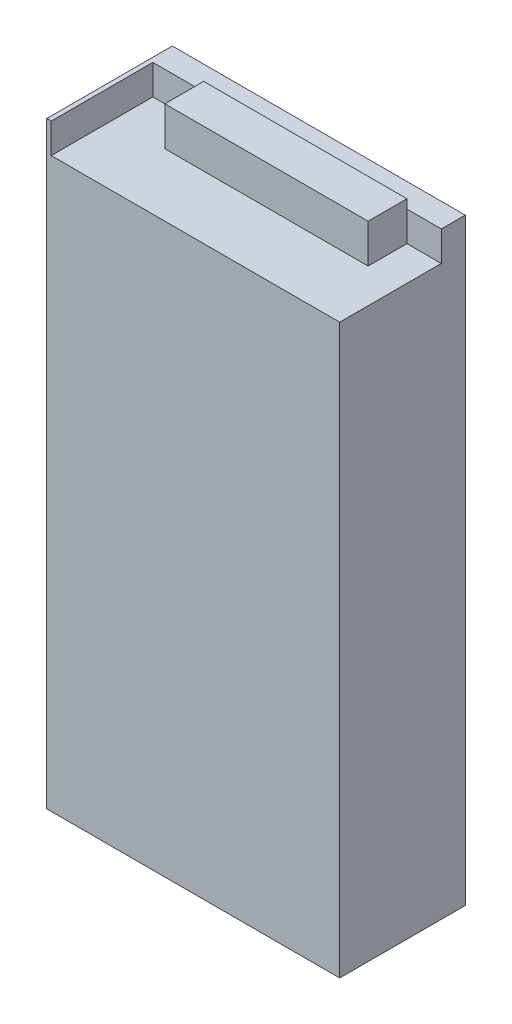
ISO-10303-21;
HEADER;
FILE_DESCRIPTION(('STEP AP214'),'2;1');
FILE_NAME('part.step','',(''),(''),'','','');
FILE_SCHEMA(('AUTOMOTIVE_DESIGN { 1 0 10303 214 1 1 1 1 }'));
ENDSEC;
DATA;
#1=APPLICATION_CONTEXT('core data for automotive mechanical design processes');
#2=APPLICATION_PROTOCOL_DEFINITION('international standard','automotive_design',2000,#1);
#3=PRODUCT_CONTEXT('',#1,'mechanical');
#4=PRODUCT('Part','Part','',(#3));
#5=PRODUCT_RELATED_PRODUCT_CATEGORY('part','',(#4));
#6=PRODUCT_DEFINITION_FORMATION('','',#4);
#7=PRODUCT_DEFINITION_CONTEXT('part definition',#1,'design');
#8=PRODUCT_DEFINITION('design','',#6,#7);
#9=PRODUCT_DEFINITION_SHAPE('','',#8);
#10=(LENGTH_UNIT() NAMED_UNIT(*) SI_UNIT(.MILLI.,.METRE.));
#11=(NAMED_UNIT(*) PLANE_ANGLE_UNIT() SI_UNIT($,.RADIAN.));
#12=(NAMED_UNIT(*) SI_UNIT($,.STERADIAN.) SOLID_ANGLE_UNIT());
#13=UNCERTAINTY_MEASURE_WITH_UNIT(LENGTH_MEASURE(1.E-05),#10,'distance_accuracy_value','');
#14=(GEOMETRIC_REPRESENTATION_CONTEXT(3) GLOBAL_UNCERTAINTY_ASSIGNED_CONTEXT((#13)) GLOBAL_UNIT_ASSIGNED_CONTEXT((#10,
#11,#12)) REPRESENTATION_CONTEXT('',''));
#15=CARTESIAN_POINT('',(0.,0.,0.));
#16=DIRECTION('',(0.,0.,1.));
#17=DIRECTION('',(1.,0.,0.));
#18=AXIS2_PLACEMENT_3D('',#15,#16,#17);
#19=CARTESIAN_POINT('',(-16.690647767675,22.3969545957918,8.));
#20=DIRECTION('',(0.,-1.,0.));
#21=DIRECTION('',(1.,0.,0.));
#22=AXIS2_PLACEMENT_3D('',#19,#20,#21);
#23=PLANE('',#22);
#24=DIRECTION('',(0.,0.,1.));
#25=VECTOR('',#24,1.);
#26=CARTESIAN_POINT('',(0.309352232325018,22.3969545957918,8.));
#27=LINE('',#26,#25);
#28=CARTESIAN_POINT('',(0.309352232325018,22.3969545957918,8.));
#29=VERTEX_POINT('',#28);
#30=CARTESIAN_POINT('',(0.309352232325019,22.3969545957918,21.));
#31=VERTEX_POINT('',#30);
#32=EDGE_CURVE('E144',#29,#31,#27,.T.);
#33=ORIENTED_EDGE('',*,*,#32,.F.);
#34=DIRECTION('',(1.,0.,0.));
#35=VECTOR('',#34,1.);
#36=CARTESIAN_POINT('',(-16.690647767675,22.3969545957918,8.));
#37=LINE('',#36,#35);
#38=CARTESIAN_POINT('',(-16.690647767675,22.3969545957918,8.));
#39=VERTEX_POINT('',#38);
#40=EDGE_CURVE('E157',#39,#29,#37,.T.);
#41=ORIENTED_EDGE('',*,*,#40,.F.);
#42=DIRECTION('',(0.,0.,1.));
#43=VECTOR('',#42,1.);
#44=CARTESIAN_POINT('',(-16.690647767675,22.3969545957918,8.));
#45=LINE('',#44,#43);
#46=CARTESIAN_POINT('',(-16.690647767675,22.3969545957918,42.));
#47=VERTEX_POINT('',#46);
#48=EDGE_CURVE('E165',#39,#47,#45,.T.);
#49=ORIENTED_EDGE('',*,*,#48,.T.);
#50=DIRECTION('',(1.,0.,0.));
#51=VECTOR('',#50,1.);
#52=CARTESIAN_POINT('',(-16.690647767675,22.3969545957918,42.));
#53=LINE('',#52,#51);
#54=CARTESIAN_POINT('',(79.8093522323251,22.3969545957918,42.));
#55=VERTEX_POINT('',#54);
#56=EDGE_CURVE('E147',#47,#55,#53,.T.);
#57=ORIENTED_EDGE('',*,*,#56,.T.);
#58=DIRECTION('',(0.,0.,1.));
#59=VECTOR('',#58,1.);
#60=CARTESIAN_POINT('',(79.8093522323251,22.3969545957918,8.));
#61=LINE('',#60,#59);
#62=CARTESIAN_POINT('',(79.8093522323251,22.3969545957918,8.));
#63=VERTEX_POINT('',#62);
#64=EDGE_CURVE('E172',#63,#55,#61,.T.);
#65=ORIENTED_EDGE('',*,*,#64,.F.);
#66=CARTESIAN_POINT('',(68.309352232325,22.3969545957918,8.));
#67=VERTEX_POINT('',#66);
#68=EDGE_CURVE('E156',#67,#63,#37,.T.);
#69=ORIENTED_EDGE('',*,*,#68,.F.);
#70=DIRECTION('',(0.,0.,-1.));
#71=VECTOR('',#70,1.);
#72=CARTESIAN_POINT('',(68.309352232325,22.3969545957918,8.));
#73=LINE('',#72,#71);
#74=CARTESIAN_POINT('',(68.309352232325,22.3969545957918,21.));
#75=VERTEX_POINT('',#74);
#76=EDGE_CURVE('E48',#75,#67,#73,.T.);
#77=ORIENTED_EDGE('',*,*,#76,.F.);
#78=DIRECTION('',(1.,0.,0.));
#79=VECTOR('',#78,1.);
#80=CARTESIAN_POINT('',(0.309352232325019,22.3969545957918,21.));
#81=LINE('',#80,#79);
#82=EDGE_CURVE('E426',#31,#75,#81,.T.);
#83=ORIENTED_EDGE('',*,*,#82,.F.);
#84=EDGE_LOOP('',(#33,#41,#49,#57,#65,#69,#77,#83));
#85=FACE_BOUND('',#84,.T.);
#86=ADVANCED_FACE('F33',(#85),#23,.F.);
#87=CARTESIAN_POINT('',(-16.690647767675,22.3969545957918,8.));
#88=DIRECTION('',(0.,0.,1.));
#89=DIRECTION('',(1.,0.,0.));
#90=AXIS2_PLACEMENT_3D('',#87,#88,#89);
#91=PLANE('',#90);
#92=ORIENTED_EDGE('',*,*,#40,.T.);
#93=DIRECTION('',(0.,1.,0.));
#94=VECTOR('',#93,1.);
#95=CARTESIAN_POINT('',(0.309352232325016,22.3969545957918,8.));
#96=LINE('',#95,#94);
#97=CARTESIAN_POINT('',(0.309352232325017,32.3969545957918,8.));
#98=VERTEX_POINT('',#97);
#99=EDGE_CURVE('E11',#29,#98,#96,.T.);
#100=ORIENTED_EDGE('',*,*,#99,.T.);
#101=DIRECTION('',(-1.,0.,0.));
#102=VECTOR('',#101,1.);
#103=CARTESIAN_POINT('',(-16.690647767675,32.3969545957918,8.));
#104=LINE('',#103,#102);
#105=CARTESIAN_POINT('',(-16.690647767675,32.3969545957918,8.));
#106=VERTEX_POINT('',#105);
#107=EDGE_CURVE('E162',#98,#106,#104,.T.);
#108=ORIENTED_EDGE('',*,*,#107,.T.);
#109=DIRECTION('',(0.,-1.,0.));
#110=VECTOR('',#109,1.);
#111=CARTESIAN_POINT('',(-16.690647767675,32.3969545957918,8.));
#112=LINE('',#111,#110);
#113=EDGE_CURVE('E153',#106,#39,#112,.T.);
#114=ORIENTED_EDGE('',*,*,#113,.T.);
#115=EDGE_LOOP('',(#92,#100,#108,#114));
#116=FACE_BOUND('',#115,.T.);
#117=ADVANCED_FACE('F252',(#116),#91,.T.);
#118=CARTESIAN_POINT('',(79.809352232325,32.3969545957918,8.));
#119=VERTEX_POINT('',#118);
#120=CARTESIAN_POINT('',(68.309352232325,32.3969545957918,8.));
#121=VERTEX_POINT('',#120);
#122=EDGE_CURVE('E163',#119,#121,#104,.T.);
#123=ORIENTED_EDGE('',*,*,#122,.T.);
#124=DIRECTION('',(0.,-1.,0.));
#125=VECTOR('',#124,1.);
#126=CARTESIAN_POINT('',(68.309352232325,22.3969545957918,8.));
#127=LINE('',#126,#125);
#128=EDGE_CURVE('E41',#121,#67,#127,.T.);
#129=ORIENTED_EDGE('',*,*,#128,.T.);
#130=ORIENTED_EDGE('',*,*,#68,.T.);
#131=DIRECTION('',(0.,1.,0.));
#132=VECTOR('',#131,1.);
#133=CARTESIAN_POINT('',(79.809352232325,32.3969545957918,8.));
#134=LINE('',#133,#132);
#135=EDGE_CURVE('E160',#63,#119,#134,.T.);
#136=ORIENTED_EDGE('',*,*,#135,.T.);
#137=EDGE_LOOP('',(#123,#129,#130,#136));
#138=FACE_BOUND('',#137,.T.);
#139=ADVANCED_FACE('F231',(#138),#91,.T.);
#140=CARTESIAN_POINT('',(-18.190647767675,-167.603045404208,0.));
#141=DIRECTION('',(0.,0.,1.));
#142=DIRECTION('',(1.,0.,0.));
#143=AXIS2_PLACEMENT_3D('',#140,#141,#142);
#144=PLANE('',#143);
#145=CARTESIAN_POINT('',(-9.19064776767497,-150.103045404208,0.));
#146=DIRECTION('',(0.,0.,1.));
#147=DIRECTION('',(1.,0.,0.));
#148=AXIS2_PLACEMENT_3D('',#145,#146,#147);
#149=CIRCLE('',#148,1.5);
#150=CARTESIAN_POINT('',(-7.69064776767497,-150.103045404208,0.));
#151=VERTEX_POINT('',#150);
#152=EDGE_CURVE('E179',#151,#151,#149,.T.);
#153=ORIENTED_EDGE('',*,*,#152,.T.);
#154=EDGE_LOOP('',(#153));
#155=FACE_BOUND('',#154,.T.);
#156=CARTESIAN_POINT('',(-9.19064776767499,-30.1030454042082,0.));
#157=DIRECTION('',(0.,0.,1.));
#158=DIRECTION('',(1.,0.,0.));
#159=AXIS2_PLACEMENT_3D('',#156,#157,#158);
#160=CIRCLE('',#159,1.5);
#161=CARTESIAN_POINT('',(-7.69064776767499,-30.1030454042082,0.));
#162=VERTEX_POINT('',#161);
#163=EDGE_CURVE('E191',#162,#162,#160,.T.);
#164=ORIENTED_EDGE('',*,*,#163,.T.);
#165=EDGE_LOOP('',(#164));
#166=FACE_BOUND('',#165,.T.);
#167=DIRECTION('',(0.,-1.,0.));
#168=VECTOR('',#167,1.);
#169=CARTESIAN_POINT('',(-18.190647767675,32.3969545957918,0.));
#170=LINE('',#169,#168);
#171=CARTESIAN_POINT('',(-18.190647767675,32.3969545957918,0.));
#172=VERTEX_POINT('',#171);
#173=CARTESIAN_POINT('',(-18.190647767675,-167.603045404208,0.));
#174=VERTEX_POINT('',#173);
#175=EDGE_CURVE('E197',#172,#174,#170,.T.);
#176=ORIENTED_EDGE('',*,*,#175,.F.);
#177=DIRECTION('',(-1.,0.,0.));
#178=VECTOR('',#177,1.);
#179=CARTESIAN_POINT('',(-18.190647767675,32.3969545957918,0.));
#180=LINE('',#179,#178);
#181=CARTESIAN_POINT('',(79.809352232325,32.3969545957918,0.));
#182=VERTEX_POINT('',#181);
#183=EDGE_CURVE('E204',#182,#172,#180,.T.);
#184=ORIENTED_EDGE('',*,*,#183,.F.);
#185=DIRECTION('',(0.,1.,0.));
#186=VECTOR('',#185,1.);
#187=CARTESIAN_POINT('',(79.809352232325,32.3969545957918,0.));
#188=LINE('',#187,#186);
#189=CARTESIAN_POINT('',(79.8093522323251,-167.603045404208,0.));
#190=VERTEX_POINT('',#189);
#191=EDGE_CURVE('E216',#190,#182,#188,.T.);
#192=ORIENTED_EDGE('',*,*,#191,.F.);
#193=DIRECTION('',(1.,0.,0.));
#194=VECTOR('',#193,1.);
#195=CARTESIAN_POINT('',(-18.190647767675,-167.603045404208,0.));
#196=LINE('',#195,#194);
#197=EDGE_CURVE('E214',#174,#190,#196,.T.);
#198=ORIENTED_EDGE('',*,*,#197,.F.);
#199=EDGE_LOOP('',(#176,#184,#192,#198));
#200=FACE_BOUND('',#199,.T.);
#201=CARTESIAN_POINT('',(70.809352232325,-30.1030454042082,0.));
#202=DIRECTION('',(0.,0.,1.));
#203=DIRECTION('',(1.,0.,0.));
#204=AXIS2_PLACEMENT_3D('',#201,#202,#203);
#205=CIRCLE('',#204,1.5);
#206=CARTESIAN_POINT('',(72.309352232325,-30.1030454042082,0.));
#207=VERTEX_POINT('',#206);
#208=EDGE_CURVE('E185',#207,#207,#205,.T.);
#209=ORIENTED_EDGE('',*,*,#208,.T.);
#210=EDGE_LOOP('',(#209));
#211=FACE_BOUND('',#210,.T.);
#212=CARTESIAN_POINT('',(70.809352232325,-150.103045404208,0.));
#213=DIRECTION('',(0.,0.,1.));
#214=DIRECTION('',(1.,0.,0.));
#215=AXIS2_PLACEMENT_3D('',#212,#213,#214);
#216=CIRCLE('',#215,1.5);
#217=CARTESIAN_POINT('',(72.309352232325,-150.103045404208,0.));
#218=VERTEX_POINT('',#217);
#219=EDGE_CURVE('E171',#218,#218,#216,.T.);
#220=ORIENTED_EDGE('',*,*,#219,.T.);
#221=EDGE_LOOP('',(#220));
#222=FACE_BOUND('',#221,.T.);
#223=ADVANCED_FACE('F266',(#155,#166,#200,#211,#222),#144,.F.);
#224=CARTESIAN_POINT('',(-18.190647767675,32.3969545957918,42.));
#225=DIRECTION('',(1.,0.,0.));
#226=DIRECTION('',(0.,1.,0.));
#227=AXIS2_PLACEMENT_3D('',#224,#225,#226);
#228=PLANE('',#227);
#229=ORIENTED_EDGE('',*,*,#175,.T.);
#230=DIRECTION('',(0.,0.,-1.));
#231=VECTOR('',#230,1.);
#232=CARTESIAN_POINT('',(-18.190647767675,-167.603045404208,42.));
#233=LINE('',#232,#231);
#234=CARTESIAN_POINT('',(-18.190647767675,-167.603045404208,42.));
#235=VERTEX_POINT('',#234);
#236=EDGE_CURVE('E227',#235,#174,#233,.T.);
#237=ORIENTED_EDGE('',*,*,#236,.F.);
#238=DIRECTION('',(0.,-1.,0.));
#239=VECTOR('',#238,1.);
#240=CARTESIAN_POINT('',(-18.190647767675,32.3969545957918,42.));
#241=LINE('',#240,#239);
#242=CARTESIAN_POINT('',(-18.190647767675,32.3969545957918,42.));
#243=VERTEX_POINT('',#242);
#244=EDGE_CURVE('E200',#243,#235,#241,.T.);
#245=ORIENTED_EDGE('',*,*,#244,.F.);
#246=DIRECTION('',(0.,0.,-1.));
#247=VECTOR('',#246,1.);
#248=CARTESIAN_POINT('',(-18.190647767675,32.3969545957918,42.));
#249=LINE('',#248,#247);
#250=EDGE_CURVE('E211',#243,#172,#249,.T.);
#251=ORIENTED_EDGE('',*,*,#250,.T.);
#252=EDGE_LOOP('',(#229,#237,#245,#251));
#253=FACE_BOUND('',#252,.T.);
#254=ADVANCED_FACE('F35',(#253),#228,.F.);
#255=CARTESIAN_POINT('',(-18.190647767675,-167.603045404208,42.));
#256=DIRECTION('',(0.,1.,0.));
#257=DIRECTION('',(0.,0.,1.));
#258=AXIS2_PLACEMENT_3D('',#255,#256,#257);
#259=PLANE('',#258);
#260=ORIENTED_EDGE('',*,*,#197,.T.);
#261=DIRECTION('',(0.,0.,-1.));
#262=VECTOR('',#261,1.);
#263=CARTESIAN_POINT('',(79.8093522323251,-167.603045404208,42.));
#264=LINE('',#263,#262);
#265=CARTESIAN_POINT('',(79.8093522323251,-167.603045404208,42.));
#266=VERTEX_POINT('',#265);
#267=EDGE_CURVE('E224',#266,#190,#264,.T.);
#268=ORIENTED_EDGE('',*,*,#267,.F.);
#269=DIRECTION('',(1.,0.,0.));
#270=VECTOR('',#269,1.);
#271=CARTESIAN_POINT('',(-18.190647767675,-167.603045404208,42.));
#272=LINE('',#271,#270);
#273=EDGE_CURVE('E203',#235,#266,#272,.T.);
#274=ORIENTED_EDGE('',*,*,#273,.F.);
#275=ORIENTED_EDGE('',*,*,#236,.T.);
#276=EDGE_LOOP('',(#260,#268,#274,#275));
#277=FACE_BOUND('',#276,.T.);
#278=ADVANCED_FACE('F269',(#277),#259,.F.);
#279=CARTESIAN_POINT('',(79.809352232325,32.3969545957918,42.));
#280=DIRECTION('',(-1.,0.,0.));
#281=DIRECTION('',(0.,-1.,0.));
#282=AXIS2_PLACEMENT_3D('',#279,#280,#281);
#283=PLANE('',#282);
#284=ORIENTED_EDGE('',*,*,#135,.F.);
#285=ORIENTED_EDGE('',*,*,#64,.T.);
#286=DIRECTION('',(0.,1.,0.));
#287=VECTOR('',#286,1.);
#288=CARTESIAN_POINT('',(79.809352232325,32.3969545957918,42.));
#289=LINE('',#288,#287);
#290=EDGE_CURVE('E206',#266,#55,#289,.T.);
#291=ORIENTED_EDGE('',*,*,#290,.F.);
#292=ORIENTED_EDGE('',*,*,#267,.T.);
#293=ORIENTED_EDGE('',*,*,#191,.T.);
#294=DIRECTION('',(0.,0.,-1.));
#295=VECTOR('',#294,1.);
#296=CARTESIAN_POINT('',(79.809352232325,32.3969545957918,42.));
#297=LINE('',#296,#295);
#298=EDGE_CURVE('E222',#119,#182,#297,.T.);
#299=ORIENTED_EDGE('',*,*,#298,.F.);
#300=EDGE_LOOP('',(#284,#285,#291,#292,#293,#299));
#301=FACE_BOUND('',#300,.T.);
#302=ADVANCED_FACE('F242',(#301),#283,.F.);
#303=CARTESIAN_POINT('',(-18.190647767675,32.3969545957918,42.));
#304=DIRECTION('',(0.,-1.,0.));
#305=DIRECTION('',(0.,0.,-1.));
#306=AXIS2_PLACEMENT_3D('',#303,#304,#305);
#307=PLANE('',#306);
#308=DIRECTION('',(-1.,0.,0.));
#309=VECTOR('',#308,1.);
#310=CARTESIAN_POINT('',(-18.190647767675,32.3969545957918,42.));
#311=LINE('',#310,#309);
#312=CARTESIAN_POINT('',(-16.690647767675,32.3969545957918,42.));
#313=VERTEX_POINT('',#312);
#314=EDGE_CURVE('E209',#313,#243,#311,.T.);
#315=ORIENTED_EDGE('',*,*,#314,.F.);
#316=DIRECTION('',(0.,0.,1.));
#317=VECTOR('',#316,1.);
#318=CARTESIAN_POINT('',(-16.690647767675,32.3969545957918,8.));
#319=LINE('',#318,#317);
#320=EDGE_CURVE('E169',#106,#313,#319,.T.);
#321=ORIENTED_EDGE('',*,*,#320,.F.);
#322=ORIENTED_EDGE('',*,*,#107,.F.);
#323=EDGE_CURVE('E166',#121,#98,#104,.T.);
#324=ORIENTED_EDGE('',*,*,#323,.F.);
#325=ORIENTED_EDGE('',*,*,#122,.F.);
#326=ORIENTED_EDGE('',*,*,#298,.T.);
#327=ORIENTED_EDGE('',*,*,#183,.T.);
#328=ORIENTED_EDGE('',*,*,#250,.F.);
#329=EDGE_LOOP('',(#315,#321,#322,#324,#325,#326,#327,#328));
#330=FACE_BOUND('',#329,.T.);
#331=ADVANCED_FACE('F246',(#330),#307,.F.);
#332=CARTESIAN_POINT('',(-18.190647767675,-167.603045404208,42.));
#333=DIRECTION('',(0.,0.,1.));
#334=DIRECTION('',(1.,0.,0.));
#335=AXIS2_PLACEMENT_3D('',#332,#333,#334);
#336=PLANE('',#335);
#337=DIRECTION('',(0.,-1.,0.));
#338=VECTOR('',#337,1.);
#339=CARTESIAN_POINT('',(-16.690647767675,32.3969545957918,42.));
#340=LINE('',#339,#338);
#341=EDGE_CURVE('E56',#313,#47,#340,.T.);
#342=ORIENTED_EDGE('',*,*,#341,.F.);
#343=ORIENTED_EDGE('',*,*,#314,.T.);
#344=ORIENTED_EDGE('',*,*,#244,.T.);
#345=ORIENTED_EDGE('',*,*,#273,.T.);
#346=ORIENTED_EDGE('',*,*,#290,.T.);
#347=ORIENTED_EDGE('',*,*,#56,.F.);
#348=EDGE_LOOP('',(#342,#343,#344,#345,#346,#347));
#349=FACE_BOUND('',#348,.T.);
#350=ADVANCED_FACE('F258',(#349),#336,.T.);
#351=CARTESIAN_POINT('',(-9.19064776767499,-30.1030454042082,5.));
#352=DIRECTION('',(0.,0.,-1.));
#353=DIRECTION('',(-1.,0.,0.));
#354=AXIS2_PLACEMENT_3D('',#351,#352,#353);
#355=CYLINDRICAL_SURFACE('',#354,1.5);
#356=CARTESIAN_POINT('',(-9.19064776767499,-30.1030454042082,5.));
#357=DIRECTION('',(0.,0.,1.));
#358=DIRECTION('',(1.,0.,0.));
#359=AXIS2_PLACEMENT_3D('',#356,#357,#358);
#360=CIRCLE('',#359,1.5);
#361=CARTESIAN_POINT('',(-7.69064776767499,-30.1030454042082,5.));
#362=VERTEX_POINT('',#361);
#363=EDGE_CURVE('E194',#362,#362,#360,.T.);
#364=ORIENTED_EDGE('',*,*,#363,.T.);
#365=EDGE_LOOP('',(#364));
#366=FACE_BOUND('',#365,.T.);
#367=ORIENTED_EDGE('',*,*,#163,.F.);
#368=EDGE_LOOP('',(#367));
#369=FACE_BOUND('',#368,.T.);
#370=ADVANCED_FACE('F316',(#366,#369),#355,.F.);
#371=CARTESIAN_POINT('',(-9.19064776767499,-30.1030454042082,5.));
#372=DIRECTION('',(0.,0.,1.));
#373=DIRECTION('',(1.,0.,0.));
#374=AXIS2_PLACEMENT_3D('',#371,#372,#373);
#375=PLANE('',#374);
#376=ORIENTED_EDGE('',*,*,#363,.F.);
#377=EDGE_LOOP('',(#376));
#378=FACE_BOUND('',#377,.T.);
#379=ADVANCED_FACE('F312',(#378),#375,.F.);
#380=CARTESIAN_POINT('',(70.809352232325,-30.1030454042082,5.));
#381=DIRECTION('',(0.,0.,-1.));
#382=DIRECTION('',(-1.,0.,0.));
#383=AXIS2_PLACEMENT_3D('',#380,#381,#382);
#384=CYLINDRICAL_SURFACE('',#383,1.5);
#385=CARTESIAN_POINT('',(70.809352232325,-30.1030454042082,5.));
#386=DIRECTION('',(0.,0.,1.));
#387=DIRECTION('',(1.,0.,0.));
#388=AXIS2_PLACEMENT_3D('',#385,#386,#387);
#389=CIRCLE('',#388,1.5);
#390=CARTESIAN_POINT('',(72.309352232325,-30.1030454042082,5.));
#391=VERTEX_POINT('',#390);
#392=EDGE_CURVE('E188',#391,#391,#389,.T.);
#393=ORIENTED_EDGE('',*,*,#392,.T.);
#394=EDGE_LOOP('',(#393));
#395=FACE_BOUND('',#394,.T.);
#396=ORIENTED_EDGE('',*,*,#208,.F.);
#397=EDGE_LOOP('',(#396));
#398=FACE_BOUND('',#397,.T.);
#399=ADVANCED_FACE('F308',(#395,#398),#384,.F.);
#400=CARTESIAN_POINT('',(70.809352232325,-30.1030454042082,5.));
#401=DIRECTION('',(0.,0.,1.));
#402=DIRECTION('',(1.,0.,0.));
#403=AXIS2_PLACEMENT_3D('',#400,#401,#402);
#404=PLANE('',#403);
#405=ORIENTED_EDGE('',*,*,#392,.F.);
#406=EDGE_LOOP('',(#405));
#407=FACE_BOUND('',#406,.T.);
#408=ADVANCED_FACE('F304',(#407),#404,.F.);
#409=CARTESIAN_POINT('',(-9.19064776767497,-150.103045404208,5.));
#410=DIRECTION('',(0.,0.,-1.));
#411=DIRECTION('',(-1.,0.,0.));
#412=AXIS2_PLACEMENT_3D('',#409,#410,#411);
#413=CYLINDRICAL_SURFACE('',#412,1.5);
#414=CARTESIAN_POINT('',(-9.19064776767497,-150.103045404208,5.));
#415=DIRECTION('',(0.,0.,1.));
#416=DIRECTION('',(1.,0.,0.));
#417=AXIS2_PLACEMENT_3D('',#414,#415,#416);
#418=CIRCLE('',#417,1.5);
#419=CARTESIAN_POINT('',(-7.69064776767497,-150.103045404208,5.));
#420=VERTEX_POINT('',#419);
#421=EDGE_CURVE('E182',#420,#420,#418,.T.);
#422=ORIENTED_EDGE('',*,*,#421,.T.);
#423=EDGE_LOOP('',(#422));
#424=FACE_BOUND('',#423,.T.);
#425=ORIENTED_EDGE('',*,*,#152,.F.);
#426=EDGE_LOOP('',(#425));
#427=FACE_BOUND('',#426,.T.);
#428=ADVANCED_FACE('F300',(#424,#427),#413,.F.);
#429=CARTESIAN_POINT('',(-9.19064776767497,-150.103045404208,5.));
#430=DIRECTION('',(0.,0.,1.));
#431=DIRECTION('',(1.,0.,0.));
#432=AXIS2_PLACEMENT_3D('',#429,#430,#431);
#433=PLANE('',#432);
#434=ORIENTED_EDGE('',*,*,#421,.F.);
#435=EDGE_LOOP('',(#434));
#436=FACE_BOUND('',#435,.T.);
#437=ADVANCED_FACE('F296',(#436),#433,.F.);
#438=CARTESIAN_POINT('',(70.809352232325,-150.103045404208,5.));
#439=DIRECTION('',(0.,0.,-1.));
#440=DIRECTION('',(-1.,0.,0.));
#441=AXIS2_PLACEMENT_3D('',#438,#439,#440);
#442=CYLINDRICAL_SURFACE('',#441,1.5);
#443=CARTESIAN_POINT('',(70.809352232325,-150.103045404208,5.));
#444=DIRECTION('',(0.,0.,1.));
#445=DIRECTION('',(1.,0.,0.));
#446=AXIS2_PLACEMENT_3D('',#443,#444,#445);
#447=CIRCLE('',#446,1.5);
#448=CARTESIAN_POINT('',(72.309352232325,-150.103045404208,5.));
#449=VERTEX_POINT('',#448);
#450=EDGE_CURVE('E176',#449,#449,#447,.T.);
#451=ORIENTED_EDGE('',*,*,#450,.T.);
#452=EDGE_LOOP('',(#451));
#453=FACE_BOUND('',#452,.T.);
#454=ORIENTED_EDGE('',*,*,#219,.F.);
#455=EDGE_LOOP('',(#454));
#456=FACE_BOUND('',#455,.T.);
#457=ADVANCED_FACE('F292',(#453,#456),#442,.F.);
#458=CARTESIAN_POINT('',(70.809352232325,-150.103045404208,5.));
#459=DIRECTION('',(0.,0.,1.));
#460=DIRECTION('',(1.,0.,0.));
#461=AXIS2_PLACEMENT_3D('',#458,#459,#460);
#462=PLANE('',#461);
#463=ORIENTED_EDGE('',*,*,#450,.F.);
#464=EDGE_LOOP('',(#463));
#465=FACE_BOUND('',#464,.T.);
#466=ADVANCED_FACE('F290',(#465),#462,.F.);
#467=CARTESIAN_POINT('',(-16.690647767675,32.3969545957918,8.));
#468=DIRECTION('',(-1.,0.,0.));
#469=DIRECTION('',(0.,0.,1.));
#470=AXIS2_PLACEMENT_3D('',#467,#468,#469);
#471=PLANE('',#470);
#472=ORIENTED_EDGE('',*,*,#341,.T.);
#473=ORIENTED_EDGE('',*,*,#48,.F.);
#474=ORIENTED_EDGE('',*,*,#113,.F.);
#475=ORIENTED_EDGE('',*,*,#320,.T.);
#476=EDGE_LOOP('',(#472,#473,#474,#475));
#477=FACE_BOUND('',#476,.T.);
#478=ADVANCED_FACE('F253',(#477),#471,.F.);
#479=CARTESIAN_POINT('',(0.309352232325017,35.3969545957918,8.));
#480=DIRECTION('',(0.,0.,1.));
#481=DIRECTION('',(1.,0.,0.));
#482=AXIS2_PLACEMENT_3D('',#479,#480,#481);
#483=PLANE('',#482);
#484=DIRECTION('',(0.,-1.,0.));
#485=VECTOR('',#484,1.);
#486=CARTESIAN_POINT('',(68.309352232325,35.3969545957918,8.));
#487=LINE('',#486,#485);
#488=CARTESIAN_POINT('',(68.309352232325,35.3969545957918,8.));
#489=VERTEX_POINT('',#488);
#490=EDGE_CURVE('E149',#489,#121,#487,.T.);
#491=ORIENTED_EDGE('',*,*,#490,.T.);
#492=ORIENTED_EDGE('',*,*,#323,.T.);
#493=DIRECTION('',(0.,-1.,0.));
#494=VECTOR('',#493,1.);
#495=CARTESIAN_POINT('',(0.309352232325017,35.3969545957918,8.));
#496=LINE('',#495,#494);
#497=CARTESIAN_POINT('',(0.309352232325017,35.3969545957918,8.));
#498=VERTEX_POINT('',#497);
#499=EDGE_CURVE('E422',#498,#98,#496,.T.);
#500=ORIENTED_EDGE('',*,*,#499,.F.);
#501=DIRECTION('',(-1.,0.,0.));
#502=VECTOR('',#501,1.);
#503=CARTESIAN_POINT('',(0.309352232325017,35.3969545957918,8.));
#504=LINE('',#503,#502);
#505=EDGE_CURVE('E137',#489,#498,#504,.T.);
#506=ORIENTED_EDGE('',*,*,#505,.F.);
#507=EDGE_LOOP('',(#491,#492,#500,#506));
#508=FACE_BOUND('',#507,.T.);
#509=ADVANCED_FACE('F289',(#508),#483,.F.);
#510=CARTESIAN_POINT('',(0.309352232325017,35.3969545957918,8.));
#511=DIRECTION('',(1.,0.,0.));
#512=DIRECTION('',(0.,0.,-1.));
#513=AXIS2_PLACEMENT_3D('',#510,#511,#512);
#514=PLANE('',#513);
#515=ORIENTED_EDGE('',*,*,#32,.T.);
#516=DIRECTION('',(0.,-1.,0.));
#517=VECTOR('',#516,1.);
#518=CARTESIAN_POINT('',(0.309352232325018,35.3969545957918,21.));
#519=LINE('',#518,#517);
#520=CARTESIAN_POINT('',(0.309352232325018,35.3969545957918,21.));
#521=VERTEX_POINT('',#520);
#522=EDGE_CURVE('E126',#521,#31,#519,.T.);
#523=ORIENTED_EDGE('',*,*,#522,.F.);
#524=DIRECTION('',(0.,0.,1.));
#525=VECTOR('',#524,1.);
#526=CARTESIAN_POINT('',(0.309352232325017,35.3969545957918,8.));
#527=LINE('',#526,#525);
#528=EDGE_CURVE('E132',#498,#521,#527,.T.);
#529=ORIENTED_EDGE('',*,*,#528,.F.);
#530=ORIENTED_EDGE('',*,*,#499,.T.);
#531=ORIENTED_EDGE('',*,*,#99,.F.);
#532=EDGE_LOOP('',(#515,#523,#529,#530,#531));
#533=FACE_BOUND('',#532,.T.);
#534=ADVANCED_FACE('F142',(#533),#514,.F.);
#535=CARTESIAN_POINT('',(0.309352232325018,35.3969545957918,21.));
#536=DIRECTION('',(0.,0.,-1.));
#537=DIRECTION('',(-1.,0.,0.));
#538=AXIS2_PLACEMENT_3D('',#535,#536,#537);
#539=PLANE('',#538);
#540=ORIENTED_EDGE('',*,*,#82,.T.);
#541=DIRECTION('',(0.,-1.,0.));
#542=VECTOR('',#541,1.);
#543=CARTESIAN_POINT('',(68.309352232325,35.3969545957918,21.));
#544=LINE('',#543,#542);
#545=CARTESIAN_POINT('',(68.309352232325,35.3969545957918,21.));
#546=VERTEX_POINT('',#545);
#547=EDGE_CURVE('E128',#546,#75,#544,.T.);
#548=ORIENTED_EDGE('',*,*,#547,.F.);
#549=DIRECTION('',(1.,0.,0.));
#550=VECTOR('',#549,1.);
#551=CARTESIAN_POINT('',(0.309352232325018,35.3969545957918,21.));
#552=LINE('',#551,#550);
#553=EDGE_CURVE('E122',#521,#546,#552,.T.);
#554=ORIENTED_EDGE('',*,*,#553,.F.);
#555=ORIENTED_EDGE('',*,*,#522,.T.);
#556=EDGE_LOOP('',(#540,#548,#554,#555));
#557=FACE_BOUND('',#556,.T.);
#558=ADVANCED_FACE('F124',(#557),#539,.F.);
#559=CARTESIAN_POINT('',(68.309352232325,35.3969545957918,8.));
#560=DIRECTION('',(-1.,0.,0.));
#561=DIRECTION('',(0.,-1.,0.));
#562=AXIS2_PLACEMENT_3D('',#559,#560,#561);
#563=PLANE('',#562);
#564=ORIENTED_EDGE('',*,*,#76,.T.);
#565=ORIENTED_EDGE('',*,*,#128,.F.);
#566=ORIENTED_EDGE('',*,*,#490,.F.);
#567=DIRECTION('',(0.,0.,-1.));
#568=VECTOR('',#567,1.);
#569=CARTESIAN_POINT('',(68.309352232325,35.3969545957918,8.));
#570=LINE('',#569,#568);
#571=EDGE_CURVE('E131',#546,#489,#570,.T.);
#572=ORIENTED_EDGE('',*,*,#571,.F.);
#573=ORIENTED_EDGE('',*,*,#547,.T.);
#574=EDGE_LOOP('',(#564,#565,#566,#572,#573));
#575=FACE_BOUND('',#574,.T.);
#576=ADVANCED_FACE('F394',(#575),#563,.F.);
#577=CARTESIAN_POINT('',(0.309352232325018,35.3969545957918,21.));
#578=DIRECTION('',(0.,1.,0.));
#579=DIRECTION('',(-1.,0.,0.));
#580=AXIS2_PLACEMENT_3D('',#577,#578,#579);
#581=PLANE('',#580);
#582=ORIENTED_EDGE('',*,*,#528,.T.);
#583=ORIENTED_EDGE('',*,*,#553,.T.);
#584=ORIENTED_EDGE('',*,*,#571,.T.);
#585=ORIENTED_EDGE('',*,*,#505,.T.);
#586=EDGE_LOOP('',(#582,#583,#584,#585));
#587=FACE_BOUND('',#586,.T.);
#588=ADVANCED_FACE('F135',(#587),#581,.T.);
#589=CLOSED_SHELL('',(#86,#117,#139,#223,#254,#278,#302,#331,#350,#370,#379,#399,#408,#428,#437,
#457,#466,#478,#509,#534,#558,#576,#588));
#590=MANIFOLD_SOLID_BREP('B2',#589);
#591=ADVANCED_BREP_SHAPE_REPRESENTATION('',(#18,#590),#14);
#592=SHAPE_DEFINITION_REPRESENTATION(#9,#591);
ENDSEC;
END-ISO-10303-21;
